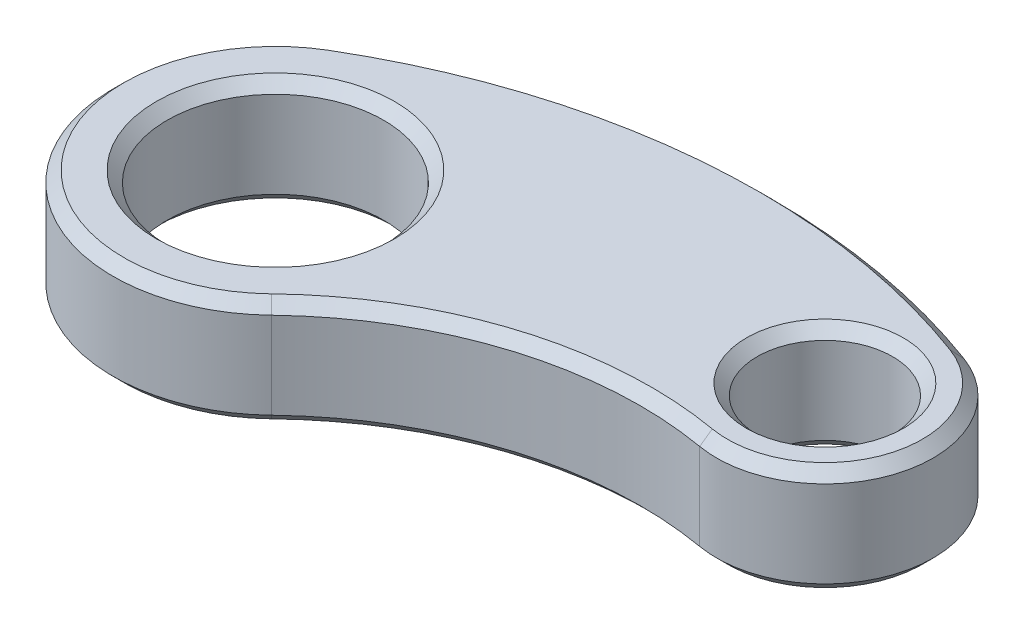
ISO-10303-21;
HEADER;
FILE_DESCRIPTION(('STEP AP214'),'2;1');
FILE_NAME('part.step','',(''),(''),'','','');
FILE_SCHEMA(('AUTOMOTIVE_DESIGN { 1 0 10303 214 1 1 1 1 }'));
ENDSEC;
DATA;
#1=APPLICATION_CONTEXT('core data for automotive mechanical design processes');
#2=APPLICATION_PROTOCOL_DEFINITION('international standard','automotive_design',2000,#1);
#3=PRODUCT_CONTEXT('',#1,'mechanical');
#4=PRODUCT('Part','Part','',(#3));
#5=PRODUCT_RELATED_PRODUCT_CATEGORY('part','',(#4));
#6=PRODUCT_DEFINITION_FORMATION('','',#4);
#7=PRODUCT_DEFINITION_CONTEXT('part definition',#1,'design');
#8=PRODUCT_DEFINITION('design','',#6,#7);
#9=PRODUCT_DEFINITION_SHAPE('','',#8);
#10=(LENGTH_UNIT() NAMED_UNIT(*) SI_UNIT(.MILLI.,.METRE.));
#11=(NAMED_UNIT(*) PLANE_ANGLE_UNIT() SI_UNIT($,.RADIAN.));
#12=(NAMED_UNIT(*) SI_UNIT($,.STERADIAN.) SOLID_ANGLE_UNIT());
#13=UNCERTAINTY_MEASURE_WITH_UNIT(LENGTH_MEASURE(1.E-05),#10,'distance_accuracy_value','');
#14=(GEOMETRIC_REPRESENTATION_CONTEXT(3) GLOBAL_UNCERTAINTY_ASSIGNED_CONTEXT((#13)) GLOBAL_UNIT_ASSIGNED_CONTEXT((#10,
#11,#12)) REPRESENTATION_CONTEXT('',''));
#15=CARTESIAN_POINT('',(0.,0.,0.));
#16=DIRECTION('',(0.,0.,1.));
#17=DIRECTION('',(1.,0.,0.));
#18=AXIS2_PLACEMENT_3D('',#15,#16,#17);
#19=CARTESIAN_POINT('',(34.7073460952422,20.,35.9916674665828));
#20=DIRECTION('',(0.,1.,0.));
#21=DIRECTION('',(0.,0.,1.));
#22=AXIS2_PLACEMENT_3D('',#19,#20,#21);
#23=PLANE('',#22);
#24=CARTESIAN_POINT('',(84.8344602404587,20.,-16.685886069869));
#25=DIRECTION('',(0.,1.,0.));
#26=DIRECTION('',(0.,0.,1.));
#27=AXIS2_PLACEMENT_3D('',#24,#25,#26);
#28=CIRCLE('',#27,14.5);
#29=CARTESIAN_POINT('',(84.8344602404587,20.,-2.185886069869));
#30=VERTEX_POINT('',#29);
#31=EDGE_CURVE('E11',#30,#30,#28,.F.);
#32=ORIENTED_EDGE('',*,*,#31,.T.);
#33=EDGE_LOOP('',(#32));
#34=FACE_BOUND('',#33,.T.);
#35=CARTESIAN_POINT('',(0.,20.,0.));
#36=DIRECTION('',(0.,1.,0.));
#37=DIRECTION('',(0.,0.,1.));
#38=AXIS2_PLACEMENT_3D('',#35,#36,#37);
#39=CIRCLE('',#38,22.);
#40=CARTESIAN_POINT('',(0.,20.,22.));
#41=VERTEX_POINT('',#40);
#42=EDGE_CURVE('E58',#41,#41,#39,.F.);
#43=ORIENTED_EDGE('',*,*,#42,.T.);
#44=EDGE_LOOP('',(#43));
#45=FACE_BOUND('',#44,.T.);
#46=CARTESIAN_POINT('',(48.3543013876079,20.,81.7732324010515));
#47=DIRECTION('',(0.,1.,0.));
#48=DIRECTION('',(0.,0.,1.));
#49=AXIS2_PLACEMENT_3D('',#46,#47,#48);
#50=CIRCLE('',#49,123.);
#51=CARTESIAN_POINT('',(91.0882017580903,20.,-33.5645920934554));
#52=VERTEX_POINT('',#51);
#53=CARTESIAN_POINT('',(-14.2517940931897,20.,-24.1015842866257));
#54=VERTEX_POINT('',#53);
#55=EDGE_CURVE('E66',#52,#54,#50,.T.);
#56=ORIENTED_EDGE('',*,*,#55,.T.);
#57=CARTESIAN_POINT('',(0.,20.,0.));
#58=DIRECTION('',(0.,1.,0.));
#59=DIRECTION('',(0.,0.,1.));
#60=AXIS2_PLACEMENT_3D('',#57,#58,#59);
#61=CIRCLE('',#60,28.);
#62=CARTESIAN_POINT('',(19.4361138133356,20.,20.1553337812864));
#63=VERTEX_POINT('',#62);
#64=EDGE_CURVE('E183',#54,#63,#61,.T.);
#65=ORIENTED_EDGE('',*,*,#64,.T.);
#66=CARTESIAN_POINT('',(69.4146921904844,20.,71.9833349331656));
#67=DIRECTION('',(0.,1.,0.));
#68=DIRECTION('',(0.,0.,1.));
#69=AXIS2_PLACEMENT_3D('',#66,#67,#68);
#70=CIRCLE('',#69,72.);
#71=CARTESIAN_POINT('',(81.7505066304639,20.,1.04795813073791));
#72=VERTEX_POINT('',#71);
#73=EDGE_CURVE('E190',#63,#72,#70,.F.);
#74=ORIENTED_EDGE('',*,*,#73,.T.);
#75=CARTESIAN_POINT('',(84.8344602404587,20.,-16.685886069869));
#76=DIRECTION('',(0.,1.,0.));
#77=DIRECTION('',(0.,0.,1.));
#78=AXIS2_PLACEMENT_3D('',#75,#76,#77);
#79=CIRCLE('',#78,18.);
#80=EDGE_CURVE('E71',#72,#52,#79,.T.);
#81=ORIENTED_EDGE('',*,*,#80,.T.);
#82=EDGE_LOOP('',(#56,#65,#74,#81));
#83=FACE_BOUND('',#82,.T.);
#84=ADVANCED_FACE('F47',(#34,#45,#83),#23,.T.);
#85=CARTESIAN_POINT('',(34.7073460952422,0.,35.9916674665828));
#86=DIRECTION('',(0.,1.,0.));
#87=DIRECTION('',(0.,0.,1.));
#88=AXIS2_PLACEMENT_3D('',#85,#86,#87);
#89=PLANE('',#88);
#90=CARTESIAN_POINT('',(0.,0.,0.));
#91=DIRECTION('',(0.,1.,0.));
#92=DIRECTION('',(0.,0.,1.));
#93=AXIS2_PLACEMENT_3D('',#90,#91,#92);
#94=CIRCLE('',#93,22.);
#95=CARTESIAN_POINT('',(0.,0.,22.));
#96=VERTEX_POINT('',#95);
#97=EDGE_CURVE('E234',#96,#96,#94,.T.);
#98=ORIENTED_EDGE('',*,*,#97,.T.);
#99=EDGE_LOOP('',(#98));
#100=FACE_BOUND('',#99,.T.);
#101=CARTESIAN_POINT('',(84.8344602404587,0.,-16.685886069869));
#102=DIRECTION('',(0.,1.,0.));
#103=DIRECTION('',(0.,0.,1.));
#104=AXIS2_PLACEMENT_3D('',#101,#102,#103);
#105=CIRCLE('',#104,14.5);
#106=CARTESIAN_POINT('',(84.8344602404587,0.,-2.18588606986903));
#107=VERTEX_POINT('',#106);
#108=EDGE_CURVE('E238',#107,#107,#105,.T.);
#109=ORIENTED_EDGE('',*,*,#108,.T.);
#110=EDGE_LOOP('',(#109));
#111=FACE_BOUND('',#110,.T.);
#112=CARTESIAN_POINT('',(84.8344602404587,0.,-16.685886069869));
#113=DIRECTION('',(0.,1.,0.));
#114=DIRECTION('',(0.,0.,1.));
#115=AXIS2_PLACEMENT_3D('',#112,#113,#114);
#116=CIRCLE('',#115,18.);
#117=CARTESIAN_POINT('',(91.0882017580903,0.,-33.5645920934554));
#118=VERTEX_POINT('',#117);
#119=CARTESIAN_POINT('',(81.7505066304639,0.,1.04795813073786));
#120=VERTEX_POINT('',#119);
#121=EDGE_CURVE('E127',#118,#120,#116,.F.);
#122=ORIENTED_EDGE('',*,*,#121,.T.);
#123=CARTESIAN_POINT('',(69.4146921904844,0.,71.9833349331656));
#124=DIRECTION('',(0.,1.,0.));
#125=DIRECTION('',(0.,0.,1.));
#126=AXIS2_PLACEMENT_3D('',#123,#124,#125);
#127=CIRCLE('',#126,72.0000000000001);
#128=CARTESIAN_POINT('',(19.4361138133356,0.,20.1553337812863));
#129=VERTEX_POINT('',#128);
#130=EDGE_CURVE('E122',#120,#129,#127,.T.);
#131=ORIENTED_EDGE('',*,*,#130,.T.);
#132=CARTESIAN_POINT('',(0.,0.,0.));
#133=DIRECTION('',(0.,1.,0.));
#134=DIRECTION('',(0.,0.,1.));
#135=AXIS2_PLACEMENT_3D('',#132,#133,#134);
#136=CIRCLE('',#135,28.);
#137=CARTESIAN_POINT('',(-14.2517940931897,0.,-24.1015842866257));
#138=VERTEX_POINT('',#137);
#139=EDGE_CURVE('E116',#129,#138,#136,.F.);
#140=ORIENTED_EDGE('',*,*,#139,.T.);
#141=CARTESIAN_POINT('',(48.3543013876079,0.,81.7732324010515));
#142=DIRECTION('',(0.,1.,0.));
#143=DIRECTION('',(0.,0.,1.));
#144=AXIS2_PLACEMENT_3D('',#141,#142,#143);
#145=CIRCLE('',#144,123.);
#146=EDGE_CURVE('E119',#138,#118,#145,.F.);
#147=ORIENTED_EDGE('',*,*,#146,.T.);
#148=EDGE_LOOP('',(#122,#131,#140,#147));
#149=FACE_BOUND('',#148,.T.);
#150=ADVANCED_FACE('F118',(#100,#111,#149),#89,.F.);
#151=CARTESIAN_POINT('',(69.4146921904844,20.,71.9833349331656));
#152=DIRECTION('',(0.,-1.,0.));
#153=DIRECTION('',(0.,0.,-1.));
#154=AXIS2_PLACEMENT_3D('',#151,#152,#153);
#155=CYLINDRICAL_SURFACE('',#154,70.);
#156=DIRECTION('',(0.,-1.,0.));
#157=VECTOR('',#156,1.);
#158=CARTESIAN_POINT('',(20.8244076571453,20.,21.5950004799497));
#159=LINE('',#158,#157);
#160=CARTESIAN_POINT('',(20.8244076571453,18.,21.5950004799497));
#161=VERTEX_POINT('',#160);
#162=CARTESIAN_POINT('',(20.8244076571453,2.00000000000002,21.5950004799497));
#163=VERTEX_POINT('',#162);
#164=EDGE_CURVE('E144',#161,#163,#159,.T.);
#165=ORIENTED_EDGE('',*,*,#164,.T.);
#166=CARTESIAN_POINT('',(69.4146921904844,2.00000000000002,71.9833349331656));
#167=DIRECTION('',(0.,1.,0.));
#168=DIRECTION('',(0.,0.,1.));
#169=AXIS2_PLACEMENT_3D('',#166,#167,#168);
#170=CIRCLE('',#169,70.);
#171=CARTESIAN_POINT('',(81.4078451182422,2.00000000000002,3.01838526413867));
#172=VERTEX_POINT('',#171);
#173=EDGE_CURVE('E211',#163,#172,#170,.F.);
#174=ORIENTED_EDGE('',*,*,#173,.T.);
#175=DIRECTION('',(0.,-1.,0.));
#176=VECTOR('',#175,1.);
#177=CARTESIAN_POINT('',(81.4078451182422,20.,3.01838526413867));
#178=LINE('',#177,#176);
#179=CARTESIAN_POINT('',(81.4078451182422,18.,3.01838526413867));
#180=VERTEX_POINT('',#179);
#181=EDGE_CURVE('E139',#180,#172,#178,.T.);
#182=ORIENTED_EDGE('',*,*,#181,.F.);
#183=CARTESIAN_POINT('',(69.4146921904844,18.,71.9833349331656));
#184=DIRECTION('',(0.,1.,0.));
#185=DIRECTION('',(0.,0.,1.));
#186=AXIS2_PLACEMENT_3D('',#183,#184,#185);
#187=CIRCLE('',#186,70.);
#188=EDGE_CURVE('E215',#180,#161,#187,.T.);
#189=ORIENTED_EDGE('',*,*,#188,.T.);
#190=EDGE_LOOP('',(#165,#174,#182,#189));
#191=FACE_BOUND('',#190,.T.);
#192=ADVANCED_FACE('F268',(#191),#155,.F.);
#193=CARTESIAN_POINT('',(84.8344602404587,20.,-16.685886069869));
#194=DIRECTION('',(0.,-1.,0.));
#195=DIRECTION('',(0.,0.,-1.));
#196=AXIS2_PLACEMENT_3D('',#193,#194,#195);
#197=CYLINDRICAL_SURFACE('',#196,20.);
#198=ORIENTED_EDGE('',*,*,#181,.T.);
#199=CARTESIAN_POINT('',(84.8344602404587,2.00000000000002,-16.685886069869));
#200=DIRECTION('',(0.,1.,0.));
#201=DIRECTION('',(0.,0.,1.));
#202=AXIS2_PLACEMENT_3D('',#199,#200,#201);
#203=CIRCLE('',#202,20.);
#204=CARTESIAN_POINT('',(91.783061926716,2.00000000000002,-35.4400038738539));
#205=VERTEX_POINT('',#204);
#206=EDGE_CURVE('E199',#172,#205,#203,.T.);
#207=ORIENTED_EDGE('',*,*,#206,.T.);
#208=DIRECTION('',(0.,-1.,0.));
#209=VECTOR('',#208,1.);
#210=CARTESIAN_POINT('',(91.783061926716,20.,-35.4400038738539));
#211=LINE('',#210,#209);
#212=CARTESIAN_POINT('',(91.783061926716,18.,-35.4400038738539));
#213=VERTEX_POINT('',#212);
#214=EDGE_CURVE('E249',#213,#205,#211,.T.);
#215=ORIENTED_EDGE('',*,*,#214,.F.);
#216=CARTESIAN_POINT('',(84.8344602404587,18.,-16.685886069869));
#217=DIRECTION('',(0.,1.,0.));
#218=DIRECTION('',(0.,0.,1.));
#219=AXIS2_PLACEMENT_3D('',#216,#217,#218);
#220=CIRCLE('',#219,20.);
#221=EDGE_CURVE('E202',#213,#180,#220,.F.);
#222=ORIENTED_EDGE('',*,*,#221,.T.);
#223=EDGE_LOOP('',(#198,#207,#215,#222));
#224=FACE_BOUND('',#223,.T.);
#225=ADVANCED_FACE('F270',(#224),#197,.T.);
#226=CARTESIAN_POINT('',(48.3543013876079,20.,81.7732324010515));
#227=DIRECTION('',(0.,-1.,0.));
#228=DIRECTION('',(0.,0.,-1.));
#229=AXIS2_PLACEMENT_3D('',#226,#227,#228);
#230=CYLINDRICAL_SURFACE('',#229,125.);
#231=ORIENTED_EDGE('',*,*,#214,.T.);
#232=CARTESIAN_POINT('',(48.3543013876079,2.00000000000002,81.7732324010515));
#233=DIRECTION('',(0.,1.,0.));
#234=DIRECTION('',(0.,0.,1.));
#235=AXIS2_PLACEMENT_3D('',#232,#233,#234);
#236=CIRCLE('',#235,125.);
#237=CARTESIAN_POINT('',(-15.2697793855604,2.00000000000002,-25.8231260213847));
#238=VERTEX_POINT('',#237);
#239=EDGE_CURVE('E193',#205,#238,#236,.T.);
#240=ORIENTED_EDGE('',*,*,#239,.T.);
#241=DIRECTION('',(0.,-1.,0.));
#242=VECTOR('',#241,1.);
#243=CARTESIAN_POINT('',(-15.2697793855604,20.,-25.8231260213847));
#244=LINE('',#243,#242);
#245=CARTESIAN_POINT('',(-15.2697793855604,18.,-25.8231260213847));
#246=VERTEX_POINT('',#245);
#247=EDGE_CURVE('E149',#246,#238,#244,.T.);
#248=ORIENTED_EDGE('',*,*,#247,.F.);
#249=CARTESIAN_POINT('',(48.3543013876079,18.,81.7732324010515));
#250=DIRECTION('',(0.,1.,0.));
#251=DIRECTION('',(0.,0.,1.));
#252=AXIS2_PLACEMENT_3D('',#249,#250,#251);
#253=CIRCLE('',#252,125.);
#254=EDGE_CURVE('E196',#246,#213,#253,.F.);
#255=ORIENTED_EDGE('',*,*,#254,.T.);
#256=EDGE_LOOP('',(#231,#240,#248,#255));
#257=FACE_BOUND('',#256,.T.);
#258=ADVANCED_FACE('F261',(#257),#230,.T.);
#259=CARTESIAN_POINT('',(0.,20.,0.));
#260=DIRECTION('',(0.,-1.,0.));
#261=DIRECTION('',(0.,0.,-1.));
#262=AXIS2_PLACEMENT_3D('',#259,#260,#261);
#263=CYLINDRICAL_SURFACE('',#262,30.);
#264=ORIENTED_EDGE('',*,*,#247,.T.);
#265=CARTESIAN_POINT('',(0.,2.00000000000002,0.));
#266=DIRECTION('',(0.,1.,0.));
#267=DIRECTION('',(0.,0.,1.));
#268=AXIS2_PLACEMENT_3D('',#265,#266,#267);
#269=CIRCLE('',#268,30.);
#270=EDGE_CURVE('E142',#238,#163,#269,.T.);
#271=ORIENTED_EDGE('',*,*,#270,.T.);
#272=ORIENTED_EDGE('',*,*,#164,.F.);
#273=CARTESIAN_POINT('',(0.,18.,0.));
#274=DIRECTION('',(0.,1.,0.));
#275=DIRECTION('',(0.,0.,1.));
#276=AXIS2_PLACEMENT_3D('',#273,#274,#275);
#277=CIRCLE('',#276,30.);
#278=EDGE_CURVE('E207',#161,#246,#277,.F.);
#279=ORIENTED_EDGE('',*,*,#278,.T.);
#280=EDGE_LOOP('',(#264,#271,#272,#279));
#281=FACE_BOUND('',#280,.T.);
#282=ADVANCED_FACE('F257',(#281),#263,.T.);
#283=CARTESIAN_POINT('',(0.,20.,0.));
#284=DIRECTION('',(0.,-1.,0.));
#285=DIRECTION('',(0.,0.,-1.));
#286=AXIS2_PLACEMENT_3D('',#283,#284,#285);
#287=CYLINDRICAL_SURFACE('',#286,20.);
#288=CARTESIAN_POINT('',(0.,2.00000000000001,0.));
#289=DIRECTION('',(0.,1.,0.));
#290=DIRECTION('',(0.,0.,1.));
#291=AXIS2_PLACEMENT_3D('',#288,#289,#290);
#292=CIRCLE('',#291,20.);
#293=CARTESIAN_POINT('',(0.,2.00000000000001,20.));
#294=VERTEX_POINT('',#293);
#295=EDGE_CURVE('E226',#294,#294,#292,.F.);
#296=ORIENTED_EDGE('',*,*,#295,.T.);
#297=EDGE_LOOP('',(#296));
#298=FACE_BOUND('',#297,.T.);
#299=CARTESIAN_POINT('',(0.,18.,0.));
#300=DIRECTION('',(0.,1.,0.));
#301=DIRECTION('',(0.,0.,1.));
#302=AXIS2_PLACEMENT_3D('',#299,#300,#301);
#303=CIRCLE('',#302,20.);
#304=CARTESIAN_POINT('',(0.,18.,20.));
#305=VERTEX_POINT('',#304);
#306=EDGE_CURVE('E230',#305,#305,#303,.T.);
#307=ORIENTED_EDGE('',*,*,#306,.T.);
#308=EDGE_LOOP('',(#307));
#309=FACE_BOUND('',#308,.T.);
#310=ADVANCED_FACE('F297',(#298,#309),#287,.F.);
#311=CARTESIAN_POINT('',(84.8344602404587,20.,-16.685886069869));
#312=DIRECTION('',(0.,-1.,0.));
#313=DIRECTION('',(0.,0.,-1.));
#314=AXIS2_PLACEMENT_3D('',#311,#312,#313);
#315=CYLINDRICAL_SURFACE('',#314,12.5);
#316=CARTESIAN_POINT('',(84.8344602404587,2.00000000000001,-16.685886069869));
#317=DIRECTION('',(0.,1.,0.));
#318=DIRECTION('',(0.,0.,1.));
#319=AXIS2_PLACEMENT_3D('',#316,#317,#318);
#320=CIRCLE('',#319,12.5);
#321=CARTESIAN_POINT('',(84.8344602404587,2.00000000000001,-4.18588606986902));
#322=VERTEX_POINT('',#321);
#323=EDGE_CURVE('E218',#322,#322,#320,.F.);
#324=ORIENTED_EDGE('',*,*,#323,.T.);
#325=EDGE_LOOP('',(#324));
#326=FACE_BOUND('',#325,.T.);
#327=CARTESIAN_POINT('',(84.8344602404587,18.,-16.685886069869));
#328=DIRECTION('',(0.,1.,0.));
#329=DIRECTION('',(0.,0.,1.));
#330=AXIS2_PLACEMENT_3D('',#327,#328,#329);
#331=CIRCLE('',#330,12.5);
#332=CARTESIAN_POINT('',(84.8344602404587,18.,-4.18588606986902));
#333=VERTEX_POINT('',#332);
#334=EDGE_CURVE('E222',#333,#333,#331,.T.);
#335=ORIENTED_EDGE('',*,*,#334,.T.);
#336=EDGE_LOOP('',(#335));
#337=FACE_BOUND('',#336,.T.);
#338=ADVANCED_FACE('F316',(#326,#337),#315,.F.);
#339=CARTESIAN_POINT('',(0.,0.,0.));
#340=DIRECTION('',(0.,-1.,0.));
#341=DIRECTION('',(0.,0.,-1.));
#342=AXIS2_PLACEMENT_3D('',#339,#340,#341);
#343=CONICAL_SURFACE('',#342,22.,0.785398163397448);
#344=ORIENTED_EDGE('',*,*,#295,.F.);
#345=EDGE_LOOP('',(#344));
#346=FACE_BOUND('',#345,.T.);
#347=ORIENTED_EDGE('',*,*,#97,.F.);
#348=EDGE_LOOP('',(#347));
#349=FACE_BOUND('',#348,.T.);
#350=ADVANCED_FACE('F309',(#346,#349),#343,.F.);
#351=CARTESIAN_POINT('',(84.8344602404587,0.,-16.685886069869));
#352=DIRECTION('',(0.,-1.,0.));
#353=DIRECTION('',(0.,0.,-1.));
#354=AXIS2_PLACEMENT_3D('',#351,#352,#353);
#355=CONICAL_SURFACE('',#354,14.5,0.785398163397444);
#356=ORIENTED_EDGE('',*,*,#323,.F.);
#357=EDGE_LOOP('',(#356));
#358=FACE_BOUND('',#357,.T.);
#359=ORIENTED_EDGE('',*,*,#108,.F.);
#360=EDGE_LOOP('',(#359));
#361=FACE_BOUND('',#360,.T.);
#362=ADVANCED_FACE('F315',(#358,#361),#355,.F.);
#363=CARTESIAN_POINT('',(48.3543013876079,2.00000000000002,81.7732324010515));
#364=DIRECTION('',(0.,1.,0.));
#365=DIRECTION('',(0.,0.,1.));
#366=AXIS2_PLACEMENT_3D('',#363,#364,#365);
#367=CONICAL_SURFACE('',#366,125.,0.785398163397455);
#368=DIRECTION('',(0.245670168605842,0.707106781186543,-0.663058193718457));
#369=VECTOR('',#368,1.);
#370=CARTESIAN_POINT('',(91.0882017580903,0.,-33.5645920934554));
#371=LINE('',#370,#369);
#372=EDGE_CURVE('E136',#118,#205,#371,.T.);
#373=ORIENTED_EDGE('',*,*,#372,.F.);
#374=ORIENTED_EDGE('',*,*,#146,.F.);
#375=DIRECTION('',(0.359912151691746,-0.707106781186543,0.608656917371867));
#376=VECTOR('',#375,1.);
#377=CARTESIAN_POINT('',(-15.2697793855604,2.00000000000002,-25.8231260213847));
#378=LINE('',#377,#376);
#379=EDGE_CURVE('E133',#238,#138,#378,.T.);
#380=ORIENTED_EDGE('',*,*,#379,.F.);
#381=ORIENTED_EDGE('',*,*,#239,.F.);
#382=EDGE_LOOP('',(#373,#374,#380,#381));
#383=FACE_BOUND('',#382,.T.);
#384=ADVANCED_FACE('F131',(#383),#367,.T.);
#385=CARTESIAN_POINT('',(0.,2.00000000000002,0.));
#386=DIRECTION('',(0.,1.,0.));
#387=DIRECTION('',(0.,0.,1.));
#388=AXIS2_PLACEMENT_3D('',#385,#386,#387);
#389=CONICAL_SURFACE('',#388,30.,0.785398163397455);
#390=ORIENTED_EDGE('',*,*,#379,.T.);
#391=ORIENTED_EDGE('',*,*,#139,.F.);
#392=DIRECTION('',(-0.490835995618687,-0.707106781186542,-0.508999042636643));
#393=VECTOR('',#392,1.);
#394=CARTESIAN_POINT('',(20.8244076571453,2.00000000000002,21.5950004799497));
#395=LINE('',#394,#393);
#396=EDGE_CURVE('E151',#163,#129,#395,.T.);
#397=ORIENTED_EDGE('',*,*,#396,.F.);
#398=ORIENTED_EDGE('',*,*,#270,.F.);
#399=EDGE_LOOP('',(#390,#391,#397,#398));
#400=FACE_BOUND('',#399,.T.);
#401=ADVANCED_FACE('F141',(#400),#389,.T.);
#402=CARTESIAN_POINT('',(84.8344602404587,2.00000000000002,-16.685886069869));
#403=DIRECTION('',(0.,1.,0.));
#404=DIRECTION('',(0.,0.,1.));
#405=AXIS2_PLACEMENT_3D('',#402,#403,#404);
#406=CONICAL_SURFACE('',#405,20.,0.785398163397454);
#407=ORIENTED_EDGE('',*,*,#372,.T.);
#408=ORIENTED_EDGE('',*,*,#206,.F.);
#409=DIRECTION('',(-0.121149139471785,0.707106781186543,0.696651193930831));
#410=VECTOR('',#409,1.);
#411=CARTESIAN_POINT('',(81.7505066304639,0.,1.04795813073786));
#412=LINE('',#411,#410);
#413=EDGE_CURVE('E169',#120,#172,#412,.T.);
#414=ORIENTED_EDGE('',*,*,#413,.F.);
#415=ORIENTED_EDGE('',*,*,#121,.F.);
#416=EDGE_LOOP('',(#407,#408,#414,#415));
#417=FACE_BOUND('',#416,.T.);
#418=ADVANCED_FACE('F264',(#417),#406,.T.);
#419=CARTESIAN_POINT('',(69.4146921904844,2.00000000000002,71.9833349331656));
#420=DIRECTION('',(0.,-1.,0.));
#421=DIRECTION('',(0.,0.,-1.));
#422=AXIS2_PLACEMENT_3D('',#419,#420,#421);
#423=CONICAL_SURFACE('',#422,70.,0.785398163397455);
#424=ORIENTED_EDGE('',*,*,#396,.T.);
#425=ORIENTED_EDGE('',*,*,#130,.F.);
#426=ORIENTED_EDGE('',*,*,#413,.T.);
#427=ORIENTED_EDGE('',*,*,#173,.F.);
#428=EDGE_LOOP('',(#424,#425,#426,#427));
#429=FACE_BOUND('',#428,.T.);
#430=ADVANCED_FACE('F265',(#429),#423,.F.);
#431=CARTESIAN_POINT('',(84.8344602404587,18.,-16.685886069869));
#432=DIRECTION('',(0.,1.,0.));
#433=DIRECTION('',(0.,0.,1.));
#434=AXIS2_PLACEMENT_3D('',#431,#432,#433);
#435=CONICAL_SURFACE('',#434,12.5,0.785398163397448);
#436=ORIENTED_EDGE('',*,*,#31,.F.);
#437=EDGE_LOOP('',(#436));
#438=FACE_BOUND('',#437,.T.);
#439=ORIENTED_EDGE('',*,*,#334,.F.);
#440=EDGE_LOOP('',(#439));
#441=FACE_BOUND('',#440,.T.);
#442=ADVANCED_FACE('F331',(#438,#441),#435,.F.);
#443=CARTESIAN_POINT('',(0.,18.,0.));
#444=DIRECTION('',(0.,1.,0.));
#445=DIRECTION('',(0.,0.,1.));
#446=AXIS2_PLACEMENT_3D('',#443,#444,#445);
#447=CONICAL_SURFACE('',#446,20.,0.785398163397448);
#448=ORIENTED_EDGE('',*,*,#42,.F.);
#449=EDGE_LOOP('',(#448));
#450=FACE_BOUND('',#449,.T.);
#451=ORIENTED_EDGE('',*,*,#306,.F.);
#452=EDGE_LOOP('',(#451));
#453=FACE_BOUND('',#452,.T.);
#454=ADVANCED_FACE('F285',(#450,#453),#447,.F.);
#455=CARTESIAN_POINT('',(84.8344602404587,20.,-16.685886069869));
#456=DIRECTION('',(0.,-1.,0.));
#457=DIRECTION('',(0.,0.,-1.));
#458=AXIS2_PLACEMENT_3D('',#455,#456,#457);
#459=CONICAL_SURFACE('',#458,18.,0.785398163397447);
#460=DIRECTION('',(0.121149139471782,0.707106781186549,-0.696651193930825));
#461=VECTOR('',#460,1.);
#462=CARTESIAN_POINT('',(81.4078451182422,18.,3.01838526413867));
#463=LINE('',#462,#461);
#464=EDGE_CURVE('E160',#180,#72,#463,.T.);
#465=ORIENTED_EDGE('',*,*,#464,.F.);
#466=ORIENTED_EDGE('',*,*,#221,.F.);
#467=DIRECTION('',(0.245670168605841,-0.707106781186549,-0.663058193718452));
#468=VECTOR('',#467,1.);
#469=CARTESIAN_POINT('',(91.0882017580903,20.,-33.5645920934554));
#470=LINE('',#469,#468);
#471=EDGE_CURVE('E52',#52,#213,#470,.T.);
#472=ORIENTED_EDGE('',*,*,#471,.F.);
#473=ORIENTED_EDGE('',*,*,#80,.F.);
#474=EDGE_LOOP('',(#465,#466,#472,#473));
#475=FACE_BOUND('',#474,.T.);
#476=ADVANCED_FACE('F50',(#475),#459,.T.);
#477=CARTESIAN_POINT('',(48.3543013876079,20.,81.7732324010515));
#478=DIRECTION('',(0.,-1.,0.));
#479=DIRECTION('',(0.,0.,-1.));
#480=AXIS2_PLACEMENT_3D('',#477,#478,#479);
#481=CONICAL_SURFACE('',#480,123.,0.785398163397448);
#482=ORIENTED_EDGE('',*,*,#471,.T.);
#483=ORIENTED_EDGE('',*,*,#254,.F.);
#484=DIRECTION('',(-0.359912151691743,-0.707106781186548,-0.608656917371863));
#485=VECTOR('',#484,1.);
#486=CARTESIAN_POINT('',(-14.2517940931897,20.,-24.1015842866257));
#487=LINE('',#486,#485);
#488=EDGE_CURVE('E158',#54,#246,#487,.T.);
#489=ORIENTED_EDGE('',*,*,#488,.F.);
#490=ORIENTED_EDGE('',*,*,#55,.F.);
#491=EDGE_LOOP('',(#482,#483,#489,#490));
#492=FACE_BOUND('',#491,.T.);
#493=ADVANCED_FACE('F278',(#492),#481,.T.);
#494=CARTESIAN_POINT('',(69.4146921904844,20.,71.9833349331656));
#495=DIRECTION('',(0.,1.,0.));
#496=DIRECTION('',(0.,0.,1.));
#497=AXIS2_PLACEMENT_3D('',#494,#495,#496);
#498=CONICAL_SURFACE('',#497,72.,0.785398163397448);
#499=ORIENTED_EDGE('',*,*,#464,.T.);
#500=ORIENTED_EDGE('',*,*,#73,.F.);
#501=DIRECTION('',(-0.490835995618684,0.707106781186548,-0.508999042636638));
#502=VECTOR('',#501,1.);
#503=CARTESIAN_POINT('',(20.8244076571453,18.,21.5950004799497));
#504=LINE('',#503,#502);
#505=EDGE_CURVE('E155',#161,#63,#504,.T.);
#506=ORIENTED_EDGE('',*,*,#505,.F.);
#507=ORIENTED_EDGE('',*,*,#188,.F.);
#508=EDGE_LOOP('',(#499,#500,#506,#507));
#509=FACE_BOUND('',#508,.T.);
#510=ADVANCED_FACE('F274',(#509),#498,.F.);
#511=CARTESIAN_POINT('',(0.,20.,0.));
#512=DIRECTION('',(0.,-1.,0.));
#513=DIRECTION('',(0.,0.,-1.));
#514=AXIS2_PLACEMENT_3D('',#511,#512,#513);
#515=CONICAL_SURFACE('',#514,28.,0.785398163397447);
#516=ORIENTED_EDGE('',*,*,#488,.T.);
#517=ORIENTED_EDGE('',*,*,#278,.F.);
#518=ORIENTED_EDGE('',*,*,#505,.T.);
#519=ORIENTED_EDGE('',*,*,#64,.F.);
#520=EDGE_LOOP('',(#516,#517,#518,#519));
#521=FACE_BOUND('',#520,.T.);
#522=ADVANCED_FACE('F276',(#521),#515,.T.);
#523=CLOSED_SHELL('',(#84,#150,#192,#225,#258,#282,#310,#338,#350,#362,#384,#401,#418,#430,#442,
#454,#476,#493,#510,#522));
#524=MANIFOLD_SOLID_BREP('B2',#523);
#525=ADVANCED_BREP_SHAPE_REPRESENTATION('',(#18,#524),#14);
#526=SHAPE_DEFINITION_REPRESENTATION(#9,#525);
ENDSEC;
END-ISO-10303-21;
